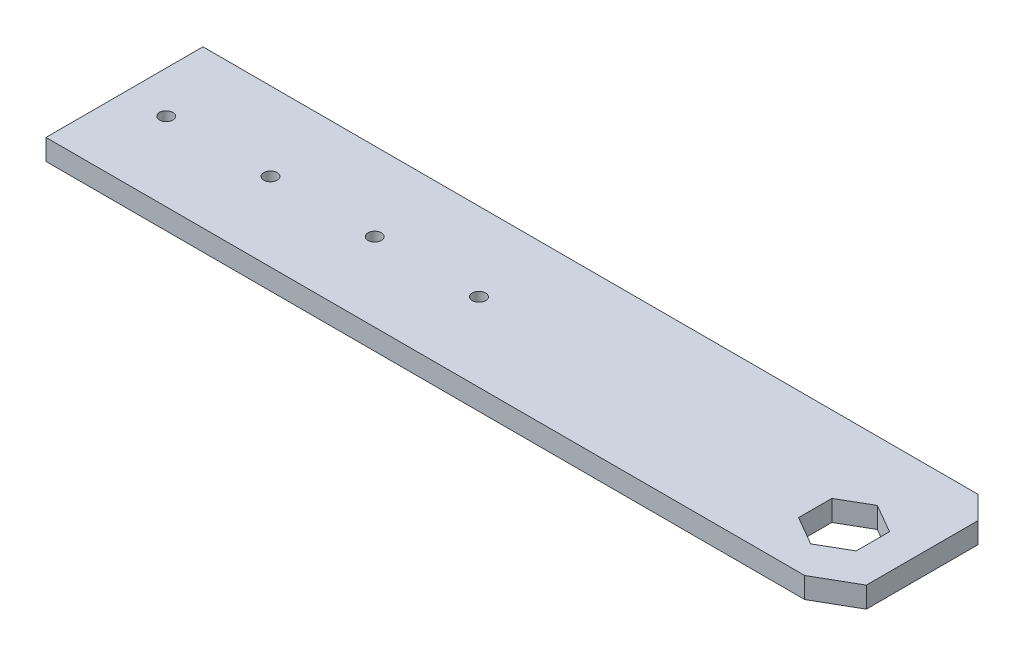
ISO-10303-21;
HEADER;
FILE_DESCRIPTION(('STEP AP214'),'2;1');
FILE_NAME('part.step','',(''),(''),'','','');
FILE_SCHEMA(('AUTOMOTIVE_DESIGN { 1 0 10303 214 1 1 1 1 }'));
ENDSEC;
DATA;
#1=APPLICATION_CONTEXT('core data for automotive mechanical design processes');
#2=APPLICATION_PROTOCOL_DEFINITION('international standard','automotive_design',2000,#1);
#3=PRODUCT_CONTEXT('',#1,'mechanical');
#4=PRODUCT('Part','Part','',(#3));
#5=PRODUCT_RELATED_PRODUCT_CATEGORY('part','',(#4));
#6=PRODUCT_DEFINITION_FORMATION('','',#4);
#7=PRODUCT_DEFINITION_CONTEXT('part definition',#1,'design');
#8=PRODUCT_DEFINITION('design','',#6,#7);
#9=PRODUCT_DEFINITION_SHAPE('','',#8);
#10=(LENGTH_UNIT() NAMED_UNIT(*) SI_UNIT(.MILLI.,.METRE.));
#11=(NAMED_UNIT(*) PLANE_ANGLE_UNIT() SI_UNIT($,.RADIAN.));
#12=(NAMED_UNIT(*) SI_UNIT($,.STERADIAN.) SOLID_ANGLE_UNIT());
#13=UNCERTAINTY_MEASURE_WITH_UNIT(LENGTH_MEASURE(1.E-05),#10,'distance_accuracy_value','');
#14=(GEOMETRIC_REPRESENTATION_CONTEXT(3) GLOBAL_UNCERTAINTY_ASSIGNED_CONTEXT((#13)) GLOBAL_UNIT_ASSIGNED_CONTEXT((#10,
#11,#12)) REPRESENTATION_CONTEXT('',''));
#15=CARTESIAN_POINT('',(0.,0.,0.));
#16=DIRECTION('',(0.,0.,1.));
#17=DIRECTION('',(1.,0.,0.));
#18=AXIS2_PLACEMENT_3D('',#15,#16,#17);
#19=CARTESIAN_POINT('',(9.86628721863141,5.,-17.088910744737));
#20=DIRECTION('',(0.5,0.,-0.866025403784439));
#21=DIRECTION('',(-0.866025403784439,0.,-0.5));
#22=AXIS2_PLACEMENT_3D('',#19,#20,#21);
#23=PLANE('',#22);
#24=DIRECTION('',(0.866025403784439,0.,0.5));
#25=VECTOR('',#24,1.);
#26=CARTESIAN_POINT('',(9.86628721863141,0.,-17.088910744737));
#27=LINE('',#26,#25);
#28=CARTESIAN_POINT('',(6.64885534702649,0.,-18.9464959019074));
#29=VERTEX_POINT('',#28);
#30=CARTESIAN_POINT('',(13.5638553470265,0.,-14.9541187904611));
#31=VERTEX_POINT('',#30);
#32=EDGE_CURVE('E210',#29,#31,#27,.T.);
#33=ORIENTED_EDGE('',*,*,#32,.F.);
#34=DIRECTION('',(0.,-1.,0.));
#35=VECTOR('',#34,1.);
#36=CARTESIAN_POINT('',(6.64885534702649,5.,-18.9464959019074));
#37=LINE('',#36,#35);
#38=CARTESIAN_POINT('',(6.64885534702649,5.,-18.9464959019074));
#39=VERTEX_POINT('',#38);
#40=EDGE_CURVE('E11',#39,#29,#37,.T.);
#41=ORIENTED_EDGE('',*,*,#40,.F.);
#42=DIRECTION('',(0.866025403784439,0.,0.5));
#43=VECTOR('',#42,1.);
#44=CARTESIAN_POINT('',(9.86628721863141,5.,-17.088910744737));
#45=LINE('',#44,#43);
#46=CARTESIAN_POINT('',(13.5638553470265,5.,-14.9541187904611));
#47=VERTEX_POINT('',#46);
#48=EDGE_CURVE('E451',#39,#47,#45,.T.);
#49=ORIENTED_EDGE('',*,*,#48,.T.);
#50=DIRECTION('',(0.,-1.,0.));
#51=VECTOR('',#50,1.);
#52=CARTESIAN_POINT('',(13.5638553470265,5.,-14.9541187904611));
#53=LINE('',#52,#51);
#54=EDGE_CURVE('E59',#47,#31,#53,.T.);
#55=ORIENTED_EDGE('',*,*,#54,.T.);
#56=EDGE_LOOP('',(#33,#41,#49,#55));
#57=FACE_BOUND('',#56,.T.);
#58=ADVANCED_FACE('F39',(#57),#23,.T.);
#59=CARTESIAN_POINT('',(6.64885534702649,5.,0.));
#60=DIRECTION('',(1.,0.,0.));
#61=DIRECTION('',(0.,0.,-1.));
#62=AXIS2_PLACEMENT_3D('',#59,#60,#61);
#63=PLANE('',#62);
#64=DIRECTION('',(0.,0.,1.));
#65=VECTOR('',#64,1.);
#66=CARTESIAN_POINT('',(6.64885534702649,0.,0.));
#67=LINE('',#66,#65);
#68=CARTESIAN_POINT('',(6.64885534702649,0.,-26.9312501247999));
#69=VERTEX_POINT('',#68);
#70=EDGE_CURVE('E213',#69,#29,#67,.T.);
#71=ORIENTED_EDGE('',*,*,#70,.F.);
#72=DIRECTION('',(0.,-1.,0.));
#73=VECTOR('',#72,1.);
#74=CARTESIAN_POINT('',(6.64885534702649,5.,-26.9312501247999));
#75=LINE('',#74,#73);
#76=CARTESIAN_POINT('',(6.64885534702649,5.,-26.9312501247999));
#77=VERTEX_POINT('',#76);
#78=EDGE_CURVE('E50',#77,#69,#75,.T.);
#79=ORIENTED_EDGE('',*,*,#78,.F.);
#80=DIRECTION('',(0.,0.,1.));
#81=VECTOR('',#80,1.);
#82=CARTESIAN_POINT('',(6.64885534702649,5.,0.));
#83=LINE('',#82,#81);
#84=EDGE_CURVE('E453',#77,#39,#83,.T.);
#85=ORIENTED_EDGE('',*,*,#84,.T.);
#86=ORIENTED_EDGE('',*,*,#40,.T.);
#87=EDGE_LOOP('',(#71,#79,#85,#86));
#88=FACE_BOUND('',#87,.T.);
#89=ADVANCED_FACE('F292',(#88),#63,.T.);
#90=CARTESIAN_POINT('',(-9.99935954511817,5.,-17.3193987752935));
#91=DIRECTION('',(0.5,0.,0.866025403784438));
#92=DIRECTION('',(0.866025403784438,0.,-0.5));
#93=AXIS2_PLACEMENT_3D('',#90,#91,#92);
#94=PLANE('',#93);
#95=DIRECTION('',(-0.866025403784438,0.,0.5));
#96=VECTOR('',#95,1.);
#97=CARTESIAN_POINT('',(-9.99935954511817,0.,-17.3193987752935));
#98=LINE('',#97,#96);
#99=CARTESIAN_POINT('',(13.5638553470265,0.,-30.9236272362462));
#100=VERTEX_POINT('',#99);
#101=EDGE_CURVE('E217',#100,#69,#98,.T.);
#102=ORIENTED_EDGE('',*,*,#101,.F.);
#103=DIRECTION('',(0.,-1.,0.));
#104=VECTOR('',#103,1.);
#105=CARTESIAN_POINT('',(13.5638553470265,5.,-30.9236272362462));
#106=LINE('',#105,#104);
#107=CARTESIAN_POINT('',(13.5638553470265,5.,-30.9236272362462));
#108=VERTEX_POINT('',#107);
#109=EDGE_CURVE('E147',#108,#100,#106,.T.);
#110=ORIENTED_EDGE('',*,*,#109,.F.);
#111=DIRECTION('',(-0.866025403784438,0.,0.5));
#112=VECTOR('',#111,1.);
#113=CARTESIAN_POINT('',(-9.99935954511817,5.,-17.3193987752935));
#114=LINE('',#113,#112);
#115=EDGE_CURVE('E158',#108,#77,#114,.T.);
#116=ORIENTED_EDGE('',*,*,#115,.T.);
#117=ORIENTED_EDGE('',*,*,#78,.T.);
#118=EDGE_LOOP('',(#102,#110,#116,#117));
#119=FACE_BOUND('',#118,.T.);
#120=ADVANCED_FACE('F297',(#119),#94,.T.);
#121=CARTESIAN_POINT('',(16.7812872186314,5.,-29.0660420790758));
#122=DIRECTION('',(-0.5,0.,0.866025403784439));
#123=DIRECTION('',(0.866025403784439,0.,0.5));
#124=AXIS2_PLACEMENT_3D('',#121,#122,#123);
#125=PLANE('',#124);
#126=DIRECTION('',(-0.866025403784439,0.,-0.5));
#127=VECTOR('',#126,1.);
#128=CARTESIAN_POINT('',(16.7812872186314,0.,-29.0660420790758));
#129=LINE('',#128,#127);
#130=CARTESIAN_POINT('',(20.4788553470265,0.,-26.9312501247999));
#131=VERTEX_POINT('',#130);
#132=EDGE_CURVE('E142',#131,#100,#129,.T.);
#133=ORIENTED_EDGE('',*,*,#132,.F.);
#134=DIRECTION('',(0.,-1.,0.));
#135=VECTOR('',#134,1.);
#136=CARTESIAN_POINT('',(20.4788553470265,5.,-26.9312501247999));
#137=LINE('',#136,#135);
#138=CARTESIAN_POINT('',(20.4788553470265,5.,-26.9312501247999));
#139=VERTEX_POINT('',#138);
#140=EDGE_CURVE('E137',#139,#131,#137,.T.);
#141=ORIENTED_EDGE('',*,*,#140,.F.);
#142=DIRECTION('',(-0.866025403784439,0.,-0.5));
#143=VECTOR('',#142,1.);
#144=CARTESIAN_POINT('',(16.7812872186314,5.,-29.0660420790758));
#145=LINE('',#144,#143);
#146=EDGE_CURVE('E140',#139,#108,#145,.T.);
#147=ORIENTED_EDGE('',*,*,#146,.T.);
#148=ORIENTED_EDGE('',*,*,#109,.T.);
#149=EDGE_LOOP('',(#133,#141,#147,#148));
#150=FACE_BOUND('',#149,.T.);
#151=ADVANCED_FACE('F139',(#150),#125,.T.);
#152=CARTESIAN_POINT('',(20.4788553470265,5.,0.));
#153=DIRECTION('',(-1.,0.,0.));
#154=DIRECTION('',(0.,0.,1.));
#155=AXIS2_PLACEMENT_3D('',#152,#153,#154);
#156=PLANE('',#155);
#157=DIRECTION('',(0.,0.,-1.));
#158=VECTOR('',#157,1.);
#159=CARTESIAN_POINT('',(20.4788553470265,0.,0.));
#160=LINE('',#159,#158);
#161=CARTESIAN_POINT('',(20.4788553470265,0.,-18.9464959019074));
#162=VERTEX_POINT('',#161);
#163=EDGE_CURVE('E223',#162,#131,#160,.T.);
#164=ORIENTED_EDGE('',*,*,#163,.F.);
#165=DIRECTION('',(0.,-1.,0.));
#166=VECTOR('',#165,1.);
#167=CARTESIAN_POINT('',(20.4788553470265,5.,-18.9464959019074));
#168=LINE('',#167,#166);
#169=CARTESIAN_POINT('',(20.4788553470265,5.,-18.9464959019074));
#170=VERTEX_POINT('',#169);
#171=EDGE_CURVE('E96',#170,#162,#168,.T.);
#172=ORIENTED_EDGE('',*,*,#171,.F.);
#173=DIRECTION('',(0.,0.,-1.));
#174=VECTOR('',#173,1.);
#175=CARTESIAN_POINT('',(20.4788553470265,5.,0.));
#176=LINE('',#175,#174);
#177=EDGE_CURVE('E155',#170,#139,#176,.T.);
#178=ORIENTED_EDGE('',*,*,#177,.T.);
#179=ORIENTED_EDGE('',*,*,#140,.T.);
#180=EDGE_LOOP('',(#164,#172,#178,#179));
#181=FACE_BOUND('',#180,.T.);
#182=ADVANCED_FACE('F161',(#181),#156,.T.);
#183=CARTESIAN_POINT('',(0.,5.,-45.3036272362462));
#184=DIRECTION('',(0.,0.,1.));
#185=DIRECTION('',(1.,0.,0.));
#186=AXIS2_PLACEMENT_3D('',#183,#184,#185);
#187=PLANE('',#186);
#188=DIRECTION('',(-1.,0.,0.));
#189=VECTOR('',#188,1.);
#190=CARTESIAN_POINT('',(0.,0.,-45.3036272362462));
#191=LINE('',#190,#189);
#192=CARTESIAN_POINT('',(23.3188553470265,0.,-45.3036272362462));
#193=VERTEX_POINT('',#192);
#194=CARTESIAN_POINT('',(-162.511144652974,0.,-45.3036272362462));
#195=VERTEX_POINT('',#194);
#196=EDGE_CURVE('E186',#193,#195,#191,.T.);
#197=ORIENTED_EDGE('',*,*,#196,.T.);
#198=DIRECTION('',(0.,-1.,0.));
#199=VECTOR('',#198,1.);
#200=CARTESIAN_POINT('',(-162.511144652974,5.,-45.3036272362462));
#201=LINE('',#200,#199);
#202=CARTESIAN_POINT('',(-162.511144652974,5.,-45.3036272362462));
#203=VERTEX_POINT('',#202);
#204=EDGE_CURVE('E43',#203,#195,#201,.T.);
#205=ORIENTED_EDGE('',*,*,#204,.F.);
#206=DIRECTION('',(-1.,0.,0.));
#207=VECTOR('',#206,1.);
#208=CARTESIAN_POINT('',(0.,5.,-45.3036272362462));
#209=LINE('',#208,#207);
#210=CARTESIAN_POINT('',(23.3188553470265,5.,-45.3036272362462));
#211=VERTEX_POINT('',#210);
#212=EDGE_CURVE('E472',#211,#203,#209,.T.);
#213=ORIENTED_EDGE('',*,*,#212,.F.);
#214=DIRECTION('',(0.,-1.,0.));
#215=VECTOR('',#214,1.);
#216=CARTESIAN_POINT('',(23.3188553470265,5.,-45.3036272362462));
#217=LINE('',#216,#215);
#218=EDGE_CURVE('E166',#211,#193,#217,.T.);
#219=ORIENTED_EDGE('',*,*,#218,.T.);
#220=EDGE_LOOP('',(#197,#205,#213,#219));
#221=FACE_BOUND('',#220,.T.);
#222=ADVANCED_FACE('F260',(#221),#187,.F.);
#223=CARTESIAN_POINT('',(-162.511144652974,5.,0.));
#224=DIRECTION('',(1.,0.,0.));
#225=DIRECTION('',(0.,0.,-1.));
#226=AXIS2_PLACEMENT_3D('',#223,#224,#225);
#227=PLANE('',#226);
#228=DIRECTION('',(0.,0.,1.));
#229=VECTOR('',#228,1.);
#230=CARTESIAN_POINT('',(-162.511144652974,0.,0.));
#231=LINE('',#230,#229);
#232=CARTESIAN_POINT('',(-162.511144652974,0.,-7.67411879046112));
#233=VERTEX_POINT('',#232);
#234=EDGE_CURVE('E190',#195,#233,#231,.T.);
#235=ORIENTED_EDGE('',*,*,#234,.T.);
#236=DIRECTION('',(0.,-1.,0.));
#237=VECTOR('',#236,1.);
#238=CARTESIAN_POINT('',(-162.511144652974,5.,-7.67411879046112));
#239=LINE('',#238,#237);
#240=CARTESIAN_POINT('',(-162.511144652974,5.,-7.67411879046112));
#241=VERTEX_POINT('',#240);
#242=EDGE_CURVE('E249',#241,#233,#239,.T.);
#243=ORIENTED_EDGE('',*,*,#242,.F.);
#244=DIRECTION('',(0.,0.,1.));
#245=VECTOR('',#244,1.);
#246=CARTESIAN_POINT('',(-162.511144652974,5.,0.));
#247=LINE('',#246,#245);
#248=EDGE_CURVE('E109',#203,#241,#247,.T.);
#249=ORIENTED_EDGE('',*,*,#248,.F.);
#250=ORIENTED_EDGE('',*,*,#204,.T.);
#251=EDGE_LOOP('',(#235,#243,#249,#250));
#252=FACE_BOUND('',#251,.T.);
#253=ADVANCED_FACE('F256',(#252),#227,.F.);
#254=CARTESIAN_POINT('',(0.,5.,-7.67411879046114));
#255=DIRECTION('',(0.,0.,1.));
#256=DIRECTION('',(1.,0.,0.));
#257=AXIS2_PLACEMENT_3D('',#254,#255,#256);
#258=PLANE('',#257);
#259=DIRECTION('',(-1.,0.,0.));
#260=VECTOR('',#259,1.);
#261=CARTESIAN_POINT('',(0.,0.,-7.67411879046114));
#262=LINE('',#261,#260);
#263=CARTESIAN_POINT('',(19.4088553470265,0.,-7.67411879046114));
#264=VERTEX_POINT('',#263);
#265=EDGE_CURVE('E194',#264,#233,#262,.T.);
#266=ORIENTED_EDGE('',*,*,#265,.F.);
#267=DIRECTION('',(0.,-1.,0.));
#268=VECTOR('',#267,1.);
#269=CARTESIAN_POINT('',(19.4088553470265,5.,-7.67411879046114));
#270=LINE('',#269,#268);
#271=CARTESIAN_POINT('',(19.4088553470265,5.,-7.67411879046114));
#272=VERTEX_POINT('',#271);
#273=EDGE_CURVE('E247',#272,#264,#270,.T.);
#274=ORIENTED_EDGE('',*,*,#273,.F.);
#275=DIRECTION('',(-1.,0.,0.));
#276=VECTOR('',#275,1.);
#277=CARTESIAN_POINT('',(0.,5.,-7.67411879046114));
#278=LINE('',#277,#276);
#279=EDGE_CURVE('E467',#272,#241,#278,.T.);
#280=ORIENTED_EDGE('',*,*,#279,.T.);
#281=ORIENTED_EDGE('',*,*,#242,.T.);
#282=EDGE_LOOP('',(#266,#274,#280,#281));
#283=FACE_BOUND('',#282,.T.);
#284=ADVANCED_FACE('F282',(#283),#258,.T.);
#285=CARTESIAN_POINT('',(1.49192068618675,5.,2.60139307846917));
#286=DIRECTION('',(0.497498378394826,0.,0.867464906203426));
#287=DIRECTION('',(0.867464906203426,0.,-0.497498378394826));
#288=AXIS2_PLACEMENT_3D('',#285,#286,#287);
#289=PLANE('',#288);
#290=DIRECTION('',(-0.867464906203426,0.,0.497498378394826));
#291=VECTOR('',#290,1.);
#292=CARTESIAN_POINT('',(1.49192068618675,0.,2.60139307846917));
#293=LINE('',#292,#291);
#294=CARTESIAN_POINT('',(28.7888553470265,0.,-13.0536272362462));
#295=VERTEX_POINT('',#294);
#296=EDGE_CURVE('E198',#295,#264,#293,.T.);
#297=ORIENTED_EDGE('',*,*,#296,.F.);
#298=DIRECTION('',(0.,-1.,0.));
#299=VECTOR('',#298,1.);
#300=CARTESIAN_POINT('',(28.7888553470265,5.,-13.0536272362462));
#301=LINE('',#300,#299);
#302=CARTESIAN_POINT('',(28.7888553470265,5.,-13.0536272362462));
#303=VERTEX_POINT('',#302);
#304=EDGE_CURVE('E244',#303,#295,#301,.T.);
#305=ORIENTED_EDGE('',*,*,#304,.F.);
#306=DIRECTION('',(-0.867464906203426,0.,0.497498378394826));
#307=VECTOR('',#306,1.);
#308=CARTESIAN_POINT('',(1.49192068618675,5.,2.60139307846917));
#309=LINE('',#308,#307);
#310=EDGE_CURVE('E280',#303,#272,#309,.T.);
#311=ORIENTED_EDGE('',*,*,#310,.T.);
#312=ORIENTED_EDGE('',*,*,#273,.T.);
#313=EDGE_LOOP('',(#297,#305,#311,#312));
#314=FACE_BOUND('',#313,.T.);
#315=ADVANCED_FACE('F277',(#314),#289,.T.);
#316=CARTESIAN_POINT('',(28.7888553470265,5.,0.));
#317=DIRECTION('',(1.,0.,0.));
#318=DIRECTION('',(0.,0.,-1.));
#319=AXIS2_PLACEMENT_3D('',#316,#317,#318);
#320=PLANE('',#319);
#321=DIRECTION('',(0.,0.,1.));
#322=VECTOR('',#321,1.);
#323=CARTESIAN_POINT('',(28.7888553470265,0.,0.));
#324=LINE('',#323,#322);
#325=CARTESIAN_POINT('',(28.7888553470265,0.,-39.8236272362462));
#326=VERTEX_POINT('',#325);
#327=EDGE_CURVE('E202',#326,#295,#324,.T.);
#328=ORIENTED_EDGE('',*,*,#327,.F.);
#329=DIRECTION('',(0.,-1.,0.));
#330=VECTOR('',#329,1.);
#331=CARTESIAN_POINT('',(28.7888553470265,5.,-39.8236272362462));
#332=LINE('',#331,#330);
#333=CARTESIAN_POINT('',(28.7888553470265,5.,-39.8236272362462));
#334=VERTEX_POINT('',#333);
#335=EDGE_CURVE('E241',#334,#326,#332,.T.);
#336=ORIENTED_EDGE('',*,*,#335,.F.);
#337=DIRECTION('',(0.,0.,1.));
#338=VECTOR('',#337,1.);
#339=CARTESIAN_POINT('',(28.7888553470265,5.,0.));
#340=LINE('',#339,#338);
#341=EDGE_CURVE('E462',#334,#303,#340,.T.);
#342=ORIENTED_EDGE('',*,*,#341,.T.);
#343=ORIENTED_EDGE('',*,*,#304,.T.);
#344=EDGE_LOOP('',(#328,#336,#342,#343));
#345=FACE_BOUND('',#344,.T.);
#346=ADVANCED_FACE('F274',(#345),#320,.T.);
#347=CARTESIAN_POINT('',(34.3324992484928,5.,-34.2698487024189));
#348=DIRECTION('',(0.707752245667564,0.,-0.70646072697109));
#349=DIRECTION('',(-0.70646072697109,0.,-0.707752245667564));
#350=AXIS2_PLACEMENT_3D('',#347,#348,#349);
#351=PLANE('',#350);
#352=DIRECTION('',(0.70646072697109,0.,0.707752245667564));
#353=VECTOR('',#352,1.);
#354=CARTESIAN_POINT('',(34.3324992484928,0.,-34.2698487024189));
#355=LINE('',#354,#353);
#356=EDGE_CURVE('E206',#193,#326,#355,.T.);
#357=ORIENTED_EDGE('',*,*,#356,.F.);
#358=ORIENTED_EDGE('',*,*,#218,.F.);
#359=DIRECTION('',(0.70646072697109,0.,0.707752245667564));
#360=VECTOR('',#359,1.);
#361=CARTESIAN_POINT('',(34.3324992484928,5.,-34.2698487024189));
#362=LINE('',#361,#360);
#363=EDGE_CURVE('E270',#211,#334,#362,.T.);
#364=ORIENTED_EDGE('',*,*,#363,.T.);
#365=ORIENTED_EDGE('',*,*,#335,.T.);
#366=EDGE_LOOP('',(#357,#358,#364,#365));
#367=FACE_BOUND('',#366,.T.);
#368=ADVANCED_FACE('F266',(#367),#351,.T.);
#369=CARTESIAN_POINT('',(-152.511144652973,5.,-26.4886272362462));
#370=DIRECTION('',(0.,-1.,0.));
#371=DIRECTION('',(0.,0.,-1.));
#372=AXIS2_PLACEMENT_3D('',#369,#370,#371);
#373=CYLINDRICAL_SURFACE('',#372,1.59999999999999);
#374=CARTESIAN_POINT('',(-152.511144652973,5.,-26.4886272362462));
#375=DIRECTION('',(0.,1.,0.));
#376=DIRECTION('',(0.,0.,1.));
#377=AXIS2_PLACEMENT_3D('',#374,#375,#376);
#378=CIRCLE('',#377,1.59999999999999);
#379=CARTESIAN_POINT('',(-152.511144652973,5.,-24.8886272362462));
#380=VERTEX_POINT('',#379);
#381=EDGE_CURVE('E475',#380,#380,#378,.T.);
#382=ORIENTED_EDGE('',*,*,#381,.T.);
#383=EDGE_LOOP('',(#382));
#384=FACE_BOUND('',#383,.T.);
#385=CARTESIAN_POINT('',(-152.511144652973,0.,-26.4886272362462));
#386=DIRECTION('',(0.,1.,0.));
#387=DIRECTION('',(0.,0.,1.));
#388=AXIS2_PLACEMENT_3D('',#385,#386,#387);
#389=CIRCLE('',#388,1.59999999999999);
#390=CARTESIAN_POINT('',(-152.511144652973,0.,-24.8886272362462));
#391=VERTEX_POINT('',#390);
#392=EDGE_CURVE('E182',#391,#391,#389,.T.);
#393=ORIENTED_EDGE('',*,*,#392,.F.);
#394=EDGE_LOOP('',(#393));
#395=FACE_BOUND('',#394,.T.);
#396=ADVANCED_FACE('F304',(#384,#395),#373,.F.);
#397=CARTESIAN_POINT('',(-127.511144652973,5.,-26.4886272362462));
#398=DIRECTION('',(0.,-1.,0.));
#399=DIRECTION('',(0.,0.,-1.));
#400=AXIS2_PLACEMENT_3D('',#397,#398,#399);
#401=CYLINDRICAL_SURFACE('',#400,1.59999999999999);
#402=CARTESIAN_POINT('',(-127.511144652973,5.,-26.4886272362462));
#403=DIRECTION('',(0.,1.,0.));
#404=DIRECTION('',(0.,0.,1.));
#405=AXIS2_PLACEMENT_3D('',#402,#403,#404);
#406=CIRCLE('',#405,1.59999999999999);
#407=CARTESIAN_POINT('',(-127.511144652973,5.,-24.8886272362462));
#408=VERTEX_POINT('',#407);
#409=EDGE_CURVE('E479',#408,#408,#406,.T.);
#410=ORIENTED_EDGE('',*,*,#409,.T.);
#411=EDGE_LOOP('',(#410));
#412=FACE_BOUND('',#411,.T.);
#413=CARTESIAN_POINT('',(-127.511144652973,0.,-26.4886272362462));
#414=DIRECTION('',(0.,1.,0.));
#415=DIRECTION('',(0.,0.,1.));
#416=AXIS2_PLACEMENT_3D('',#413,#414,#415);
#417=CIRCLE('',#416,1.59999999999999);
#418=CARTESIAN_POINT('',(-127.511144652973,0.,-24.8886272362462));
#419=VERTEX_POINT('',#418);
#420=EDGE_CURVE('E178',#419,#419,#417,.T.);
#421=ORIENTED_EDGE('',*,*,#420,.F.);
#422=EDGE_LOOP('',(#421));
#423=FACE_BOUND('',#422,.T.);
#424=ADVANCED_FACE('F320',(#412,#423),#401,.F.);
#425=CARTESIAN_POINT('',(-102.511144652974,5.,-26.4886272362462));
#426=DIRECTION('',(0.,-1.,0.));
#427=DIRECTION('',(0.,0.,-1.));
#428=AXIS2_PLACEMENT_3D('',#425,#426,#427);
#429=CYLINDRICAL_SURFACE('',#428,1.6);
#430=CARTESIAN_POINT('',(-102.511144652974,5.,-26.4886272362462));
#431=DIRECTION('',(0.,1.,0.));
#432=DIRECTION('',(0.,0.,1.));
#433=AXIS2_PLACEMENT_3D('',#430,#431,#432);
#434=CIRCLE('',#433,1.6);
#435=CARTESIAN_POINT('',(-102.511144652974,5.,-24.8886272362462));
#436=VERTEX_POINT('',#435);
#437=EDGE_CURVE('E483',#436,#436,#434,.T.);
#438=ORIENTED_EDGE('',*,*,#437,.T.);
#439=EDGE_LOOP('',(#438));
#440=FACE_BOUND('',#439,.T.);
#441=CARTESIAN_POINT('',(-102.511144652974,0.,-26.4886272362462));
#442=DIRECTION('',(0.,1.,0.));
#443=DIRECTION('',(0.,0.,1.));
#444=AXIS2_PLACEMENT_3D('',#441,#442,#443);
#445=CIRCLE('',#444,1.6);
#446=CARTESIAN_POINT('',(-102.511144652974,0.,-24.8886272362462));
#447=VERTEX_POINT('',#446);
#448=EDGE_CURVE('E174',#447,#447,#445,.T.);
#449=ORIENTED_EDGE('',*,*,#448,.F.);
#450=EDGE_LOOP('',(#449));
#451=FACE_BOUND('',#450,.T.);
#452=ADVANCED_FACE('F328',(#440,#451),#429,.F.);
#453=CARTESIAN_POINT('',(-77.5111446529735,5.,-26.4886272362462));
#454=DIRECTION('',(0.,-1.,0.));
#455=DIRECTION('',(0.,0.,-1.));
#456=AXIS2_PLACEMENT_3D('',#453,#454,#455);
#457=CYLINDRICAL_SURFACE('',#456,1.6);
#458=CARTESIAN_POINT('',(-77.5111446529735,5.,-26.4886272362462));
#459=DIRECTION('',(0.,1.,0.));
#460=DIRECTION('',(0.,0.,1.));
#461=AXIS2_PLACEMENT_3D('',#458,#459,#460);
#462=CIRCLE('',#461,1.6);
#463=CARTESIAN_POINT('',(-77.5111446529735,5.,-24.8886272362462));
#464=VERTEX_POINT('',#463);
#465=EDGE_CURVE('E230',#464,#464,#462,.T.);
#466=ORIENTED_EDGE('',*,*,#465,.T.);
#467=EDGE_LOOP('',(#466));
#468=FACE_BOUND('',#467,.T.);
#469=CARTESIAN_POINT('',(-77.5111446529735,0.,-26.4886272362462));
#470=DIRECTION('',(0.,1.,0.));
#471=DIRECTION('',(0.,0.,1.));
#472=AXIS2_PLACEMENT_3D('',#469,#470,#471);
#473=CIRCLE('',#472,1.6);
#474=CARTESIAN_POINT('',(-77.5111446529735,0.,-24.8886272362462));
#475=VERTEX_POINT('',#474);
#476=EDGE_CURVE('E170',#475,#475,#473,.T.);
#477=ORIENTED_EDGE('',*,*,#476,.F.);
#478=EDGE_LOOP('',(#477));
#479=FACE_BOUND('',#478,.T.);
#480=ADVANCED_FACE('F41',(#468,#479),#457,.F.);
#481=CARTESIAN_POINT('',(-3.08435954511816,5.,-5.34226744095469));
#482=DIRECTION('',(-0.5,0.,-0.866025403784439));
#483=DIRECTION('',(-0.866025403784439,0.,0.5));
#484=AXIS2_PLACEMENT_3D('',#481,#482,#483);
#485=PLANE('',#484);
#486=DIRECTION('',(0.866025403784439,0.,-0.5));
#487=VECTOR('',#486,1.);
#488=CARTESIAN_POINT('',(-3.08435954511816,0.,-5.34226744095469));
#489=LINE('',#488,#487);
#490=EDGE_CURVE('E226',#31,#162,#489,.T.);
#491=ORIENTED_EDGE('',*,*,#490,.F.);
#492=ORIENTED_EDGE('',*,*,#54,.F.);
#493=DIRECTION('',(0.866025403784439,0.,-0.5));
#494=VECTOR('',#493,1.);
#495=CARTESIAN_POINT('',(-3.08435954511816,5.,-5.34226744095469));
#496=LINE('',#495,#494);
#497=EDGE_CURVE('E163',#47,#170,#496,.T.);
#498=ORIENTED_EDGE('',*,*,#497,.T.);
#499=ORIENTED_EDGE('',*,*,#171,.T.);
#500=EDGE_LOOP('',(#491,#492,#498,#499));
#501=FACE_BOUND('',#500,.T.);
#502=ADVANCED_FACE('F342',(#501),#485,.T.);
#503=CARTESIAN_POINT('',(0.,5.,0.));
#504=DIRECTION('',(0.,1.,0.));
#505=DIRECTION('',(0.,0.,1.));
#506=AXIS2_PLACEMENT_3D('',#503,#504,#505);
#507=PLANE('',#506);
#508=ORIENTED_EDGE('',*,*,#465,.F.);
#509=EDGE_LOOP('',(#508));
#510=FACE_BOUND('',#509,.T.);
#511=ORIENTED_EDGE('',*,*,#437,.F.);
#512=EDGE_LOOP('',(#511));
#513=FACE_BOUND('',#512,.T.);
#514=ORIENTED_EDGE('',*,*,#409,.F.);
#515=EDGE_LOOP('',(#514));
#516=FACE_BOUND('',#515,.T.);
#517=ORIENTED_EDGE('',*,*,#381,.F.);
#518=EDGE_LOOP('',(#517));
#519=FACE_BOUND('',#518,.T.);
#520=ORIENTED_EDGE('',*,*,#212,.T.);
#521=ORIENTED_EDGE('',*,*,#248,.T.);
#522=ORIENTED_EDGE('',*,*,#279,.F.);
#523=ORIENTED_EDGE('',*,*,#310,.F.);
#524=ORIENTED_EDGE('',*,*,#341,.F.);
#525=ORIENTED_EDGE('',*,*,#363,.F.);
#526=EDGE_LOOP('',(#520,#521,#522,#523,#524,#525));
#527=FACE_BOUND('',#526,.T.);
#528=ORIENTED_EDGE('',*,*,#48,.F.);
#529=ORIENTED_EDGE('',*,*,#84,.F.);
#530=ORIENTED_EDGE('',*,*,#115,.F.);
#531=ORIENTED_EDGE('',*,*,#146,.F.);
#532=ORIENTED_EDGE('',*,*,#177,.F.);
#533=ORIENTED_EDGE('',*,*,#497,.F.);
#534=EDGE_LOOP('',(#528,#529,#530,#531,#532,#533));
#535=FACE_BOUND('',#534,.T.);
#536=ADVANCED_FACE('F153',(#510,#513,#516,#519,#527,#535),#507,.T.);
#537=CARTESIAN_POINT('',(0.,0.,0.));
#538=DIRECTION('',(0.,1.,0.));
#539=DIRECTION('',(0.,0.,1.));
#540=AXIS2_PLACEMENT_3D('',#537,#538,#539);
#541=PLANE('',#540);
#542=ORIENTED_EDGE('',*,*,#476,.T.);
#543=EDGE_LOOP('',(#542));
#544=FACE_BOUND('',#543,.T.);
#545=ORIENTED_EDGE('',*,*,#448,.T.);
#546=EDGE_LOOP('',(#545));
#547=FACE_BOUND('',#546,.T.);
#548=ORIENTED_EDGE('',*,*,#420,.T.);
#549=EDGE_LOOP('',(#548));
#550=FACE_BOUND('',#549,.T.);
#551=ORIENTED_EDGE('',*,*,#392,.T.);
#552=EDGE_LOOP('',(#551));
#553=FACE_BOUND('',#552,.T.);
#554=ORIENTED_EDGE('',*,*,#196,.F.);
#555=ORIENTED_EDGE('',*,*,#356,.T.);
#556=ORIENTED_EDGE('',*,*,#327,.T.);
#557=ORIENTED_EDGE('',*,*,#296,.T.);
#558=ORIENTED_EDGE('',*,*,#265,.T.);
#559=ORIENTED_EDGE('',*,*,#234,.F.);
#560=EDGE_LOOP('',(#554,#555,#556,#557,#558,#559));
#561=FACE_BOUND('',#560,.T.);
#562=ORIENTED_EDGE('',*,*,#32,.T.);
#563=ORIENTED_EDGE('',*,*,#490,.T.);
#564=ORIENTED_EDGE('',*,*,#163,.T.);
#565=ORIENTED_EDGE('',*,*,#132,.T.);
#566=ORIENTED_EDGE('',*,*,#101,.T.);
#567=ORIENTED_EDGE('',*,*,#70,.T.);
#568=EDGE_LOOP('',(#562,#563,#564,#565,#566,#567));
#569=FACE_BOUND('',#568,.T.);
#570=ADVANCED_FACE('F263',(#544,#547,#550,#553,#561,#569),#541,.F.);
#571=CLOSED_SHELL('',(#58,#89,#120,#151,#182,#222,#253,#284,#315,#346,#368,#396,#424,#452,#480,
#502,#536,#570));
#572=MANIFOLD_SOLID_BREP('B2',#571);
#573=ADVANCED_BREP_SHAPE_REPRESENTATION('',(#18,#572),#14);
#574=SHAPE_DEFINITION_REPRESENTATION(#9,#573);
ENDSEC;
END-ISO-10303-21;
